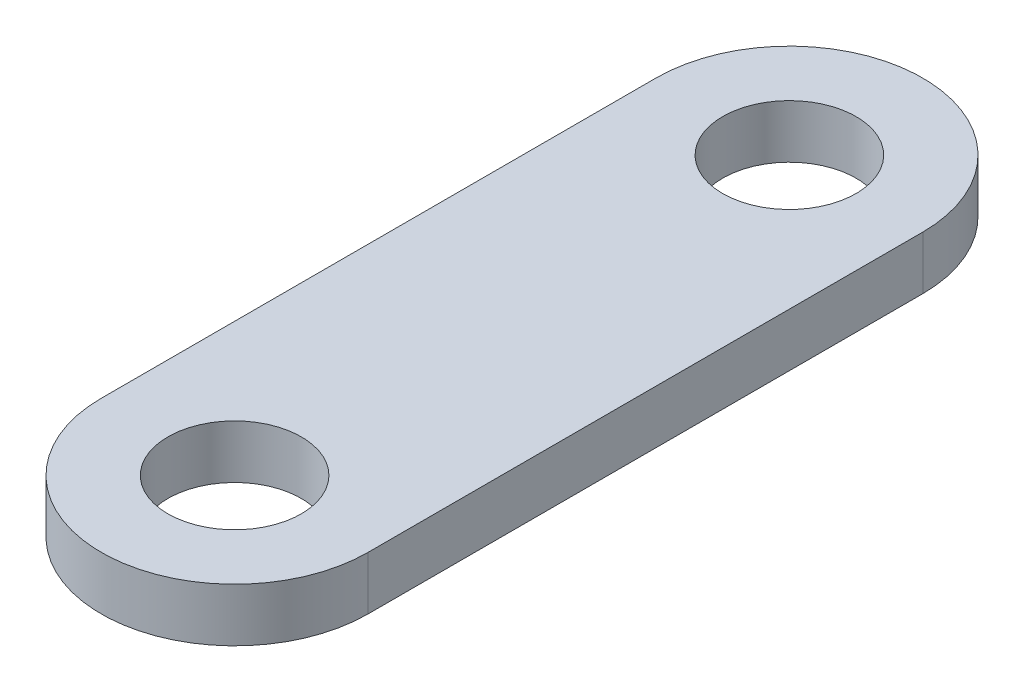
ISO-10303-21;
HEADER;
FILE_DESCRIPTION(('STEP AP214'),'2;1');
FILE_NAME('part.step','',(''),(''),'','','');
FILE_SCHEMA(('AUTOMOTIVE_DESIGN { 1 0 10303 214 1 1 1 1 }'));
ENDSEC;
DATA;
#1=APPLICATION_CONTEXT('core data for automotive mechanical design processes');
#2=APPLICATION_PROTOCOL_DEFINITION('international standard','automotive_design',2000,#1);
#3=PRODUCT_CONTEXT('',#1,'mechanical');
#4=PRODUCT('Part','Part','',(#3));
#5=PRODUCT_RELATED_PRODUCT_CATEGORY('part','',(#4));
#6=PRODUCT_DEFINITION_FORMATION('','',#4);
#7=PRODUCT_DEFINITION_CONTEXT('part definition',#1,'design');
#8=PRODUCT_DEFINITION('design','',#6,#7);
#9=PRODUCT_DEFINITION_SHAPE('','',#8);
#10=(LENGTH_UNIT() NAMED_UNIT(*) SI_UNIT(.MILLI.,.METRE.));
#11=(NAMED_UNIT(*) PLANE_ANGLE_UNIT() SI_UNIT($,.RADIAN.));
#12=(NAMED_UNIT(*) SI_UNIT($,.STERADIAN.) SOLID_ANGLE_UNIT());
#13=UNCERTAINTY_MEASURE_WITH_UNIT(LENGTH_MEASURE(1.E-05),#10,'distance_accuracy_value','');
#14=(GEOMETRIC_REPRESENTATION_CONTEXT(3) GLOBAL_UNCERTAINTY_ASSIGNED_CONTEXT((#13)) GLOBAL_UNIT_ASSIGNED_CONTEXT((#10,
#11,#12)) REPRESENTATION_CONTEXT('',''));
#15=CARTESIAN_POINT('',(0.,0.,0.));
#16=DIRECTION('',(0.,0.,1.));
#17=DIRECTION('',(1.,0.,0.));
#18=AXIS2_PLACEMENT_3D('',#15,#16,#17);
#19=CARTESIAN_POINT('',(0.,-2.,10.395));
#20=DIRECTION('',(0.,1.,0.));
#21=DIRECTION('',(0.,0.,1.));
#22=AXIS2_PLACEMENT_3D('',#19,#20,#21);
#23=CYLINDRICAL_SURFACE('',#22,5.);
#24=CARTESIAN_POINT('',(0.,0.,10.395));
#25=DIRECTION('',(0.,1.,0.));
#26=DIRECTION('',(0.,0.,1.));
#27=AXIS2_PLACEMENT_3D('',#24,#25,#26);
#28=CIRCLE('',#27,5.);
#29=CARTESIAN_POINT('',(-5.,0.,10.395));
#30=VERTEX_POINT('',#29);
#31=CARTESIAN_POINT('',(5.,0.,10.395));
#32=VERTEX_POINT('',#31);
#33=EDGE_CURVE('E101',#30,#32,#28,.T.);
#34=ORIENTED_EDGE('',*,*,#33,.F.);
#35=DIRECTION('',(0.,1.,0.));
#36=VECTOR('',#35,1.);
#37=CARTESIAN_POINT('',(-5.,-2.,10.395));
#38=LINE('',#37,#36);
#39=CARTESIAN_POINT('',(-5.,-2.,10.395));
#40=VERTEX_POINT('',#39);
#41=EDGE_CURVE('E11',#40,#30,#38,.T.);
#42=ORIENTED_EDGE('',*,*,#41,.F.);
#43=CARTESIAN_POINT('',(0.,-2.,10.395));
#44=DIRECTION('',(0.,1.,0.));
#45=DIRECTION('',(0.,0.,1.));
#46=AXIS2_PLACEMENT_3D('',#43,#44,#45);
#47=CIRCLE('',#46,5.);
#48=CARTESIAN_POINT('',(5.,-2.,10.395));
#49=VERTEX_POINT('',#48);
#50=EDGE_CURVE('E94',#40,#49,#47,.T.);
#51=ORIENTED_EDGE('',*,*,#50,.T.);
#52=DIRECTION('',(0.,1.,0.));
#53=VECTOR('',#52,1.);
#54=CARTESIAN_POINT('',(5.,-2.,10.395));
#55=LINE('',#54,#53);
#56=EDGE_CURVE('E39',#49,#32,#55,.T.);
#57=ORIENTED_EDGE('',*,*,#56,.T.);
#58=EDGE_LOOP('',(#34,#42,#51,#57));
#59=FACE_BOUND('',#58,.T.);
#60=ADVANCED_FACE('F36',(#59),#23,.T.);
#61=CARTESIAN_POINT('',(-5.,-2.,10.395));
#62=DIRECTION('',(-1.,0.,0.));
#63=DIRECTION('',(0.,0.,1.));
#64=AXIS2_PLACEMENT_3D('',#61,#62,#63);
#65=PLANE('',#64);
#66=DIRECTION('',(0.,0.,1.));
#67=VECTOR('',#66,1.);
#68=CARTESIAN_POINT('',(-5.,0.,10.395));
#69=LINE('',#68,#67);
#70=CARTESIAN_POINT('',(-5.,0.,-10.395));
#71=VERTEX_POINT('',#70);
#72=EDGE_CURVE('E96',#71,#30,#69,.T.);
#73=ORIENTED_EDGE('',*,*,#72,.F.);
#74=DIRECTION('',(0.,1.,0.));
#75=VECTOR('',#74,1.);
#76=CARTESIAN_POINT('',(-5.,-2.,-10.395));
#77=LINE('',#76,#75);
#78=CARTESIAN_POINT('',(-5.,-2.,-10.395));
#79=VERTEX_POINT('',#78);
#80=EDGE_CURVE('E45',#79,#71,#77,.T.);
#81=ORIENTED_EDGE('',*,*,#80,.F.);
#82=DIRECTION('',(0.,0.,1.));
#83=VECTOR('',#82,1.);
#84=CARTESIAN_POINT('',(-5.,-2.,10.395));
#85=LINE('',#84,#83);
#86=EDGE_CURVE('E91',#79,#40,#85,.T.);
#87=ORIENTED_EDGE('',*,*,#86,.T.);
#88=ORIENTED_EDGE('',*,*,#41,.T.);
#89=EDGE_LOOP('',(#73,#81,#87,#88));
#90=FACE_BOUND('',#89,.T.);
#91=ADVANCED_FACE('F112',(#90),#65,.T.);
#92=CARTESIAN_POINT('',(0.,-2.,-10.395));
#93=DIRECTION('',(0.,1.,0.));
#94=DIRECTION('',(0.,0.,1.));
#95=AXIS2_PLACEMENT_3D('',#92,#93,#94);
#96=CYLINDRICAL_SURFACE('',#95,5.);
#97=CARTESIAN_POINT('',(0.,0.,-10.395));
#98=DIRECTION('',(0.,1.,0.));
#99=DIRECTION('',(0.,0.,1.));
#100=AXIS2_PLACEMENT_3D('',#97,#98,#99);
#101=CIRCLE('',#100,5.);
#102=CARTESIAN_POINT('',(5.,0.,-10.395));
#103=VERTEX_POINT('',#102);
#104=EDGE_CURVE('E86',#103,#71,#101,.T.);
#105=ORIENTED_EDGE('',*,*,#104,.F.);
#106=DIRECTION('',(0.,1.,0.));
#107=VECTOR('',#106,1.);
#108=CARTESIAN_POINT('',(5.,-2.,-10.395));
#109=LINE('',#108,#107);
#110=CARTESIAN_POINT('',(5.,-2.,-10.395));
#111=VERTEX_POINT('',#110);
#112=EDGE_CURVE('E81',#111,#103,#109,.T.);
#113=ORIENTED_EDGE('',*,*,#112,.F.);
#114=CARTESIAN_POINT('',(0.,-2.,-10.395));
#115=DIRECTION('',(0.,1.,0.));
#116=DIRECTION('',(0.,0.,1.));
#117=AXIS2_PLACEMENT_3D('',#114,#115,#116);
#118=CIRCLE('',#117,5.);
#119=EDGE_CURVE('E84',#111,#79,#118,.T.);
#120=ORIENTED_EDGE('',*,*,#119,.T.);
#121=ORIENTED_EDGE('',*,*,#80,.T.);
#122=EDGE_LOOP('',(#105,#113,#120,#121));
#123=FACE_BOUND('',#122,.T.);
#124=ADVANCED_FACE('F83',(#123),#96,.T.);
#125=CARTESIAN_POINT('',(5.,-2.,10.395));
#126=DIRECTION('',(1.,0.,0.));
#127=DIRECTION('',(0.,0.,-1.));
#128=AXIS2_PLACEMENT_3D('',#125,#126,#127);
#129=PLANE('',#128);
#130=DIRECTION('',(0.,0.,-1.));
#131=VECTOR('',#130,1.);
#132=CARTESIAN_POINT('',(5.,0.,10.395));
#133=LINE('',#132,#131);
#134=EDGE_CURVE('E104',#32,#103,#133,.T.);
#135=ORIENTED_EDGE('',*,*,#134,.F.);
#136=ORIENTED_EDGE('',*,*,#56,.F.);
#137=DIRECTION('',(0.,0.,-1.));
#138=VECTOR('',#137,1.);
#139=CARTESIAN_POINT('',(5.,-2.,10.395));
#140=LINE('',#139,#138);
#141=EDGE_CURVE('E90',#49,#111,#140,.T.);
#142=ORIENTED_EDGE('',*,*,#141,.T.);
#143=ORIENTED_EDGE('',*,*,#112,.T.);
#144=EDGE_LOOP('',(#135,#136,#142,#143));
#145=FACE_BOUND('',#144,.T.);
#146=ADVANCED_FACE('F93',(#145),#129,.T.);
#147=CARTESIAN_POINT('',(0.,-2.,10.395));
#148=DIRECTION('',(0.,1.,0.));
#149=DIRECTION('',(0.,0.,1.));
#150=AXIS2_PLACEMENT_3D('',#147,#148,#149);
#151=PLANE('',#150);
#152=CARTESIAN_POINT('',(0.,-2.,-10.395));
#153=DIRECTION('',(0.,1.,0.));
#154=DIRECTION('',(0.,0.,1.));
#155=AXIS2_PLACEMENT_3D('',#152,#153,#154);
#156=CIRCLE('',#155,2.5);
#157=CARTESIAN_POINT('',(0.,-2.,-7.895));
#158=VERTEX_POINT('',#157);
#159=EDGE_CURVE('E145',#158,#158,#156,.T.);
#160=ORIENTED_EDGE('',*,*,#159,.T.);
#161=EDGE_LOOP('',(#160));
#162=FACE_BOUND('',#161,.T.);
#163=CARTESIAN_POINT('',(0.,-2.,10.395));
#164=DIRECTION('',(0.,1.,0.));
#165=DIRECTION('',(0.,0.,1.));
#166=AXIS2_PLACEMENT_3D('',#163,#164,#165);
#167=CIRCLE('',#166,2.5);
#168=CARTESIAN_POINT('',(0.,-2.,12.895));
#169=VERTEX_POINT('',#168);
#170=EDGE_CURVE('E105',#169,#169,#167,.T.);
#171=ORIENTED_EDGE('',*,*,#170,.T.);
#172=EDGE_LOOP('',(#171));
#173=FACE_BOUND('',#172,.T.);
#174=ORIENTED_EDGE('',*,*,#50,.F.);
#175=ORIENTED_EDGE('',*,*,#86,.F.);
#176=ORIENTED_EDGE('',*,*,#119,.F.);
#177=ORIENTED_EDGE('',*,*,#141,.F.);
#178=EDGE_LOOP('',(#174,#175,#176,#177));
#179=FACE_BOUND('',#178,.T.);
#180=ADVANCED_FACE('F89',(#162,#173,#179),#151,.F.);
#181=CARTESIAN_POINT('',(0.,0.,10.395));
#182=DIRECTION('',(0.,1.,0.));
#183=DIRECTION('',(0.,0.,1.));
#184=AXIS2_PLACEMENT_3D('',#181,#182,#183);
#185=PLANE('',#184);
#186=CARTESIAN_POINT('',(0.,0.,-10.395));
#187=DIRECTION('',(0.,1.,0.));
#188=DIRECTION('',(0.,0.,1.));
#189=AXIS2_PLACEMENT_3D('',#186,#187,#188);
#190=CIRCLE('',#189,2.5);
#191=CARTESIAN_POINT('',(0.,0.,-7.895));
#192=VERTEX_POINT('',#191);
#193=EDGE_CURVE('E148',#192,#192,#190,.T.);
#194=ORIENTED_EDGE('',*,*,#193,.F.);
#195=EDGE_LOOP('',(#194));
#196=FACE_BOUND('',#195,.T.);
#197=CARTESIAN_POINT('',(0.,0.,10.395));
#198=DIRECTION('',(0.,1.,0.));
#199=DIRECTION('',(0.,0.,1.));
#200=AXIS2_PLACEMENT_3D('',#197,#198,#199);
#201=CIRCLE('',#200,2.5);
#202=CARTESIAN_POINT('',(0.,0.,12.895));
#203=VERTEX_POINT('',#202);
#204=EDGE_CURVE('E150',#203,#203,#201,.T.);
#205=ORIENTED_EDGE('',*,*,#204,.F.);
#206=EDGE_LOOP('',(#205));
#207=FACE_BOUND('',#206,.T.);
#208=ORIENTED_EDGE('',*,*,#33,.T.);
#209=ORIENTED_EDGE('',*,*,#134,.T.);
#210=ORIENTED_EDGE('',*,*,#104,.T.);
#211=ORIENTED_EDGE('',*,*,#72,.T.);
#212=EDGE_LOOP('',(#208,#209,#210,#211));
#213=FACE_BOUND('',#212,.T.);
#214=ADVANCED_FACE('F111',(#196,#207,#213),#185,.T.);
#215=CARTESIAN_POINT('',(0.,-2.,10.395));
#216=DIRECTION('',(0.,1.,0.));
#217=DIRECTION('',(0.,0.,1.));
#218=AXIS2_PLACEMENT_3D('',#215,#216,#217);
#219=CYLINDRICAL_SURFACE('',#218,2.5);
#220=ORIENTED_EDGE('',*,*,#170,.F.);
#221=EDGE_LOOP('',(#220));
#222=FACE_BOUND('',#221,.T.);
#223=ORIENTED_EDGE('',*,*,#204,.T.);
#224=EDGE_LOOP('',(#223));
#225=FACE_BOUND('',#224,.T.);
#226=ADVANCED_FACE('F130',(#222,#225),#219,.F.);
#227=CARTESIAN_POINT('',(0.,-2.,-10.395));
#228=DIRECTION('',(0.,1.,0.));
#229=DIRECTION('',(0.,0.,1.));
#230=AXIS2_PLACEMENT_3D('',#227,#228,#229);
#231=CYLINDRICAL_SURFACE('',#230,2.5);
#232=ORIENTED_EDGE('',*,*,#159,.F.);
#233=EDGE_LOOP('',(#232));
#234=FACE_BOUND('',#233,.T.);
#235=ORIENTED_EDGE('',*,*,#193,.T.);
#236=EDGE_LOOP('',(#235));
#237=FACE_BOUND('',#236,.T.);
#238=ADVANCED_FACE('F137',(#234,#237),#231,.F.);
#239=CLOSED_SHELL('',(#60,#91,#124,#146,#180,#214,#226,#238));
#240=MANIFOLD_SOLID_BREP('B2',#239);
#241=ADVANCED_BREP_SHAPE_REPRESENTATION('',(#18,#240),#14);
#242=SHAPE_DEFINITION_REPRESENTATION(#9,#241);
ENDSEC;
END-ISO-10303-21;
